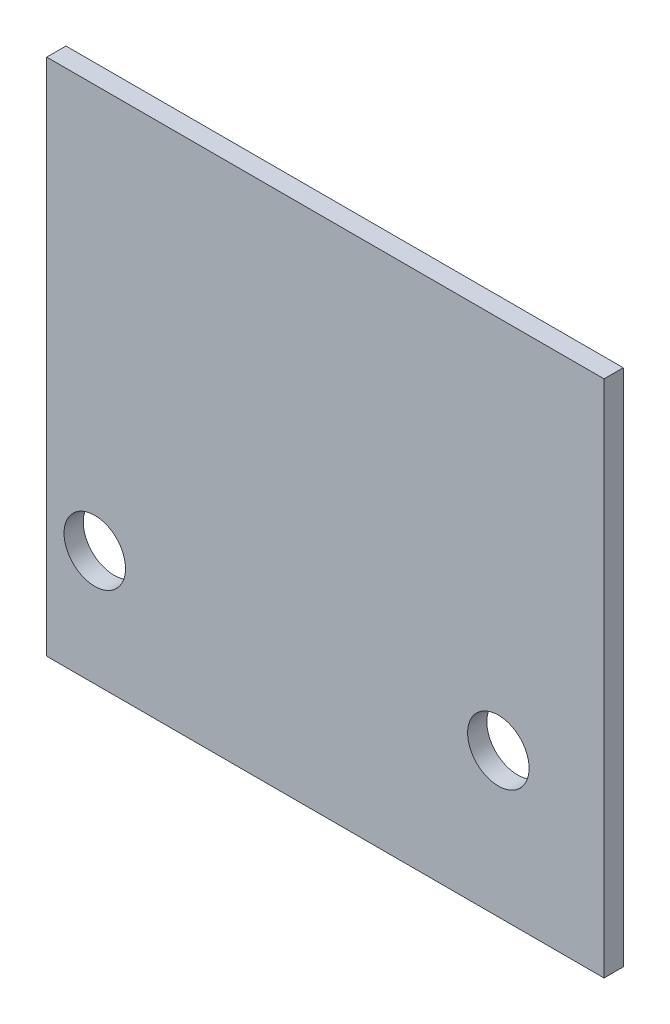
ISO-10303-21;
HEADER;
FILE_DESCRIPTION(('STEP AP214'),'2;1');
FILE_NAME('part.step','',(''),(''),'','','');
FILE_SCHEMA(('AUTOMOTIVE_DESIGN { 1 0 10303 214 1 1 1 1 }'));
ENDSEC;
DATA;
#1=APPLICATION_CONTEXT('core data for automotive mechanical design processes');
#2=APPLICATION_PROTOCOL_DEFINITION('international standard','automotive_design',2000,#1);
#3=PRODUCT_CONTEXT('',#1,'mechanical');
#4=PRODUCT('Part','Part','',(#3));
#5=PRODUCT_RELATED_PRODUCT_CATEGORY('part','',(#4));
#6=PRODUCT_DEFINITION_FORMATION('','',#4);
#7=PRODUCT_DEFINITION_CONTEXT('part definition',#1,'design');
#8=PRODUCT_DEFINITION('design','',#6,#7);
#9=PRODUCT_DEFINITION_SHAPE('','',#8);
#10=(LENGTH_UNIT() NAMED_UNIT(*) SI_UNIT(.MILLI.,.METRE.));
#11=(NAMED_UNIT(*) PLANE_ANGLE_UNIT() SI_UNIT($,.RADIAN.));
#12=(NAMED_UNIT(*) SI_UNIT($,.STERADIAN.) SOLID_ANGLE_UNIT());
#13=UNCERTAINTY_MEASURE_WITH_UNIT(LENGTH_MEASURE(1.E-05),#10,'distance_accuracy_value','');
#14=(GEOMETRIC_REPRESENTATION_CONTEXT(3) GLOBAL_UNCERTAINTY_ASSIGNED_CONTEXT((#13)) GLOBAL_UNIT_ASSIGNED_CONTEXT((#10,
#11,#12)) REPRESENTATION_CONTEXT('',''));
#15=CARTESIAN_POINT('',(0.,0.,0.));
#16=DIRECTION('',(0.,0.,1.));
#17=DIRECTION('',(1.,0.,0.));
#18=AXIS2_PLACEMENT_3D('',#15,#16,#17);
#19=CARTESIAN_POINT('',(14.5,-13.5,1.));
#20=DIRECTION('',(-1.,0.,0.));
#21=DIRECTION('',(0.,0.,1.));
#22=AXIS2_PLACEMENT_3D('',#19,#20,#21);
#23=PLANE('',#22);
#24=DIRECTION('',(0.,1.,0.));
#25=VECTOR('',#24,1.);
#26=CARTESIAN_POINT('',(14.5,-13.5,0.));
#27=LINE('',#26,#25);
#28=CARTESIAN_POINT('',(14.5,-13.5,0.));
#29=VERTEX_POINT('',#28);
#30=CARTESIAN_POINT('',(14.5,13.5,0.));
#31=VERTEX_POINT('',#30);
#32=EDGE_CURVE('E111',#29,#31,#27,.T.);
#33=ORIENTED_EDGE('',*,*,#32,.T.);
#34=DIRECTION('',(0.,0.,-1.));
#35=VECTOR('',#34,1.);
#36=CARTESIAN_POINT('',(14.5,13.5,1.));
#37=LINE('',#36,#35);
#38=CARTESIAN_POINT('',(14.5,13.5,1.));
#39=VERTEX_POINT('',#38);
#40=EDGE_CURVE('E11',#39,#31,#37,.T.);
#41=ORIENTED_EDGE('',*,*,#40,.F.);
#42=DIRECTION('',(0.,1.,0.));
#43=VECTOR('',#42,1.);
#44=CARTESIAN_POINT('',(14.5,-13.5,1.));
#45=LINE('',#44,#43);
#46=CARTESIAN_POINT('',(14.5,-13.5,1.));
#47=VERTEX_POINT('',#46);
#48=EDGE_CURVE('E95',#47,#39,#45,.T.);
#49=ORIENTED_EDGE('',*,*,#48,.F.);
#50=DIRECTION('',(0.,0.,-1.));
#51=VECTOR('',#50,1.);
#52=CARTESIAN_POINT('',(14.5,-13.5,1.));
#53=LINE('',#52,#51);
#54=EDGE_CURVE('E107',#47,#29,#53,.T.);
#55=ORIENTED_EDGE('',*,*,#54,.T.);
#56=EDGE_LOOP('',(#33,#41,#49,#55));
#57=FACE_BOUND('',#56,.T.);
#58=ADVANCED_FACE('F43',(#57),#23,.F.);
#59=CARTESIAN_POINT('',(-14.5,13.5,1.));
#60=DIRECTION('',(0.,-1.,0.));
#61=DIRECTION('',(0.,0.,-1.));
#62=AXIS2_PLACEMENT_3D('',#59,#60,#61);
#63=PLANE('',#62);
#64=DIRECTION('',(-1.,0.,0.));
#65=VECTOR('',#64,1.);
#66=CARTESIAN_POINT('',(-14.5,13.5,0.));
#67=LINE('',#66,#65);
#68=CARTESIAN_POINT('',(-14.5,13.5,0.));
#69=VERTEX_POINT('',#68);
#70=EDGE_CURVE('E100',#31,#69,#67,.T.);
#71=ORIENTED_EDGE('',*,*,#70,.T.);
#72=DIRECTION('',(0.,0.,-1.));
#73=VECTOR('',#72,1.);
#74=CARTESIAN_POINT('',(-14.5,13.5,1.));
#75=LINE('',#74,#73);
#76=CARTESIAN_POINT('',(-14.5,13.5,1.));
#77=VERTEX_POINT('',#76);
#78=EDGE_CURVE('E52',#77,#69,#75,.T.);
#79=ORIENTED_EDGE('',*,*,#78,.F.);
#80=DIRECTION('',(-1.,0.,0.));
#81=VECTOR('',#80,1.);
#82=CARTESIAN_POINT('',(-14.5,13.5,1.));
#83=LINE('',#82,#81);
#84=EDGE_CURVE('E90',#39,#77,#83,.T.);
#85=ORIENTED_EDGE('',*,*,#84,.F.);
#86=ORIENTED_EDGE('',*,*,#40,.T.);
#87=EDGE_LOOP('',(#71,#79,#85,#86));
#88=FACE_BOUND('',#87,.T.);
#89=ADVANCED_FACE('F99',(#88),#63,.F.);
#90=CARTESIAN_POINT('',(-14.5,-13.5,1.));
#91=DIRECTION('',(1.,0.,0.));
#92=DIRECTION('',(0.,0.,-1.));
#93=AXIS2_PLACEMENT_3D('',#90,#91,#92);
#94=PLANE('',#93);
#95=DIRECTION('',(0.,-1.,0.));
#96=VECTOR('',#95,1.);
#97=CARTESIAN_POINT('',(-14.5,-13.5,0.));
#98=LINE('',#97,#96);
#99=CARTESIAN_POINT('',(-14.5,-13.5,0.));
#100=VERTEX_POINT('',#99);
#101=EDGE_CURVE('E77',#69,#100,#98,.T.);
#102=ORIENTED_EDGE('',*,*,#101,.T.);
#103=DIRECTION('',(0.,0.,-1.));
#104=VECTOR('',#103,1.);
#105=CARTESIAN_POINT('',(-14.5,-13.5,1.));
#106=LINE('',#105,#104);
#107=CARTESIAN_POINT('',(-14.5,-13.5,1.));
#108=VERTEX_POINT('',#107);
#109=EDGE_CURVE('E102',#108,#100,#106,.T.);
#110=ORIENTED_EDGE('',*,*,#109,.F.);
#111=DIRECTION('',(0.,-1.,0.));
#112=VECTOR('',#111,1.);
#113=CARTESIAN_POINT('',(-14.5,-13.5,1.));
#114=LINE('',#113,#112);
#115=EDGE_CURVE('E93',#77,#108,#114,.T.);
#116=ORIENTED_EDGE('',*,*,#115,.F.);
#117=ORIENTED_EDGE('',*,*,#78,.T.);
#118=EDGE_LOOP('',(#102,#110,#116,#117));
#119=FACE_BOUND('',#118,.T.);
#120=ADVANCED_FACE('F103',(#119),#94,.F.);
#121=CARTESIAN_POINT('',(-14.5,-13.5,1.));
#122=DIRECTION('',(0.,1.,0.));
#123=DIRECTION('',(0.,0.,1.));
#124=AXIS2_PLACEMENT_3D('',#121,#122,#123);
#125=PLANE('',#124);
#126=DIRECTION('',(1.,0.,0.));
#127=VECTOR('',#126,1.);
#128=CARTESIAN_POINT('',(-14.5,-13.5,0.));
#129=LINE('',#128,#127);
#130=EDGE_CURVE('E83',#100,#29,#129,.T.);
#131=ORIENTED_EDGE('',*,*,#130,.T.);
#132=ORIENTED_EDGE('',*,*,#54,.F.);
#133=DIRECTION('',(1.,0.,0.));
#134=VECTOR('',#133,1.);
#135=CARTESIAN_POINT('',(-14.5,-13.5,1.));
#136=LINE('',#135,#134);
#137=EDGE_CURVE('E60',#108,#47,#136,.T.);
#138=ORIENTED_EDGE('',*,*,#137,.F.);
#139=ORIENTED_EDGE('',*,*,#109,.T.);
#140=EDGE_LOOP('',(#131,#132,#138,#139));
#141=FACE_BOUND('',#140,.T.);
#142=ADVANCED_FACE('F125',(#141),#125,.F.);
#143=CARTESIAN_POINT('',(0.,0.,1.));
#144=DIRECTION('',(0.,0.,-1.));
#145=DIRECTION('',(-1.,0.,0.));
#146=AXIS2_PLACEMENT_3D('',#143,#144,#145);
#147=PLANE('',#146);
#148=CARTESIAN_POINT('',(9.,-6.,1.));
#149=DIRECTION('',(0.,0.,1.));
#150=DIRECTION('',(1.,0.,0.));
#151=AXIS2_PLACEMENT_3D('',#148,#149,#150);
#152=CIRCLE('',#151,1.6);
#153=CARTESIAN_POINT('',(10.6,-6.,1.));
#154=VERTEX_POINT('',#153);
#155=EDGE_CURVE('E140',#154,#154,#152,.T.);
#156=ORIENTED_EDGE('',*,*,#155,.F.);
#157=EDGE_LOOP('',(#156));
#158=FACE_BOUND('',#157,.T.);
#159=CARTESIAN_POINT('',(-12.,-7.5,1.));
#160=DIRECTION('',(0.,0.,1.));
#161=DIRECTION('',(1.,0.,0.));
#162=AXIS2_PLACEMENT_3D('',#159,#160,#161);
#163=CIRCLE('',#162,1.6);
#164=CARTESIAN_POINT('',(-10.4,-7.5,1.));
#165=VERTEX_POINT('',#164);
#166=EDGE_CURVE('E136',#165,#165,#163,.T.);
#167=ORIENTED_EDGE('',*,*,#166,.F.);
#168=EDGE_LOOP('',(#167));
#169=FACE_BOUND('',#168,.T.);
#170=ORIENTED_EDGE('',*,*,#48,.T.);
#171=ORIENTED_EDGE('',*,*,#84,.T.);
#172=ORIENTED_EDGE('',*,*,#115,.T.);
#173=ORIENTED_EDGE('',*,*,#137,.T.);
#174=EDGE_LOOP('',(#170,#171,#172,#173));
#175=FACE_BOUND('',#174,.T.);
#176=ADVANCED_FACE('F91',(#158,#169,#175),#147,.F.);
#177=CARTESIAN_POINT('',(0.,0.,0.));
#178=DIRECTION('',(0.,0.,-1.));
#179=DIRECTION('',(-1.,0.,0.));
#180=AXIS2_PLACEMENT_3D('',#177,#178,#179);
#181=PLANE('',#180);
#182=CARTESIAN_POINT('',(9.,-6.,0.));
#183=DIRECTION('',(0.,0.,1.));
#184=DIRECTION('',(1.,0.,0.));
#185=AXIS2_PLACEMENT_3D('',#182,#183,#184);
#186=CIRCLE('',#185,1.6);
#187=CARTESIAN_POINT('',(10.6,-6.,0.));
#188=VERTEX_POINT('',#187);
#189=EDGE_CURVE('E115',#188,#188,#186,.T.);
#190=ORIENTED_EDGE('',*,*,#189,.T.);
#191=EDGE_LOOP('',(#190));
#192=FACE_BOUND('',#191,.T.);
#193=CARTESIAN_POINT('',(-12.,-7.5,0.));
#194=DIRECTION('',(0.,0.,1.));
#195=DIRECTION('',(1.,0.,0.));
#196=AXIS2_PLACEMENT_3D('',#193,#194,#195);
#197=CIRCLE('',#196,1.6);
#198=CARTESIAN_POINT('',(-10.4,-7.5,0.));
#199=VERTEX_POINT('',#198);
#200=EDGE_CURVE('E132',#199,#199,#197,.T.);
#201=ORIENTED_EDGE('',*,*,#200,.T.);
#202=EDGE_LOOP('',(#201));
#203=FACE_BOUND('',#202,.T.);
#204=ORIENTED_EDGE('',*,*,#32,.F.);
#205=ORIENTED_EDGE('',*,*,#130,.F.);
#206=ORIENTED_EDGE('',*,*,#101,.F.);
#207=ORIENTED_EDGE('',*,*,#70,.F.);
#208=EDGE_LOOP('',(#204,#205,#206,#207));
#209=FACE_BOUND('',#208,.T.);
#210=ADVANCED_FACE('F128',(#192,#203,#209),#181,.T.);
#211=CARTESIAN_POINT('',(-12.,-7.5,0.));
#212=DIRECTION('',(0.,0.,1.));
#213=DIRECTION('',(1.,0.,0.));
#214=AXIS2_PLACEMENT_3D('',#211,#212,#213);
#215=CYLINDRICAL_SURFACE('',#214,1.6);
#216=ORIENTED_EDGE('',*,*,#200,.F.);
#217=EDGE_LOOP('',(#216));
#218=FACE_BOUND('',#217,.T.);
#219=ORIENTED_EDGE('',*,*,#166,.T.);
#220=EDGE_LOOP('',(#219));
#221=FACE_BOUND('',#220,.T.);
#222=ADVANCED_FACE('F153',(#218,#221),#215,.F.);
#223=CARTESIAN_POINT('',(9.,-6.,0.));
#224=DIRECTION('',(0.,0.,1.));
#225=DIRECTION('',(1.,0.,0.));
#226=AXIS2_PLACEMENT_3D('',#223,#224,#225);
#227=CYLINDRICAL_SURFACE('',#226,1.6);
#228=ORIENTED_EDGE('',*,*,#189,.F.);
#229=EDGE_LOOP('',(#228));
#230=FACE_BOUND('',#229,.T.);
#231=ORIENTED_EDGE('',*,*,#155,.T.);
#232=EDGE_LOOP('',(#231));
#233=FACE_BOUND('',#232,.T.);
#234=ADVANCED_FACE('F150',(#230,#233),#227,.F.);
#235=CLOSED_SHELL('',(#58,#89,#120,#142,#176,#210,#222,#234));
#236=MANIFOLD_SOLID_BREP('B2',#235);
#237=ADVANCED_BREP_SHAPE_REPRESENTATION('',(#18,#236),#14);
#238=SHAPE_DEFINITION_REPRESENTATION(#9,#237);
ENDSEC;
END-ISO-10303-21;
